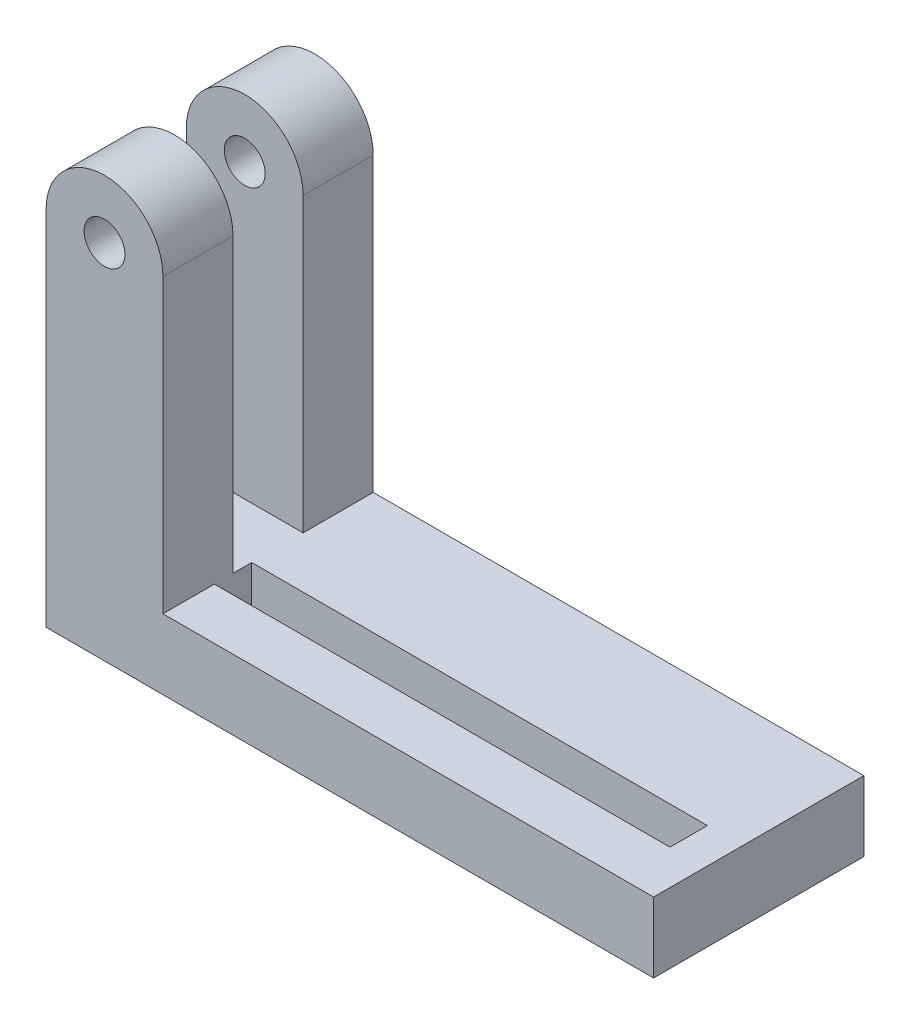
ISO-10303-21;
HEADER;
FILE_DESCRIPTION(('STEP AP214'),'2;1');
FILE_NAME('part.step','',(''),(''),'','','');
FILE_SCHEMA(('AUTOMOTIVE_DESIGN { 1 0 10303 214 1 1 1 1 }'));
ENDSEC;
DATA;
#1=APPLICATION_CONTEXT('core data for automotive mechanical design processes');
#2=APPLICATION_PROTOCOL_DEFINITION('international standard','automotive_design',2000,#1);
#3=PRODUCT_CONTEXT('',#1,'mechanical');
#4=PRODUCT('Part','Part','',(#3));
#5=PRODUCT_RELATED_PRODUCT_CATEGORY('part','',(#4));
#6=PRODUCT_DEFINITION_FORMATION('','',#4);
#7=PRODUCT_DEFINITION_CONTEXT('part definition',#1,'design');
#8=PRODUCT_DEFINITION('design','',#6,#7);
#9=PRODUCT_DEFINITION_SHAPE('','',#8);
#10=(LENGTH_UNIT() NAMED_UNIT(*) SI_UNIT(.MILLI.,.METRE.));
#11=(NAMED_UNIT(*) PLANE_ANGLE_UNIT() SI_UNIT($,.RADIAN.));
#12=(NAMED_UNIT(*) SI_UNIT($,.STERADIAN.) SOLID_ANGLE_UNIT());
#13=UNCERTAINTY_MEASURE_WITH_UNIT(LENGTH_MEASURE(1.E-05),#10,'distance_accuracy_value','');
#14=(GEOMETRIC_REPRESENTATION_CONTEXT(3) GLOBAL_UNCERTAINTY_ASSIGNED_CONTEXT((#13)) GLOBAL_UNIT_ASSIGNED_CONTEXT((#10,
#11,#12)) REPRESENTATION_CONTEXT('',''));
#15=CARTESIAN_POINT('',(0.,0.,0.));
#16=DIRECTION('',(0.,0.,1.));
#17=DIRECTION('',(1.,0.,0.));
#18=AXIS2_PLACEMENT_3D('',#15,#16,#17);
#19=CARTESIAN_POINT('',(-5.,7.611589663273,6.));
#20=DIRECTION('',(0.,0.,-1.));
#21=DIRECTION('',(-1.,0.,0.));
#22=AXIS2_PLACEMENT_3D('',#19,#20,#21);
#23=CYLINDRICAL_SURFACE('',#22,1.75);
#24=CARTESIAN_POINT('',(-5.,7.611589663273,6.));
#25=DIRECTION('',(0.,0.,-1.));
#26=DIRECTION('',(-1.,0.,0.));
#27=AXIS2_PLACEMENT_3D('',#24,#25,#26);
#28=CIRCLE('',#27,1.75);
#29=CARTESIAN_POINT('',(-6.75,7.611589663273,6.));
#30=VERTEX_POINT('',#29);
#31=EDGE_CURVE('E210',#30,#30,#28,.F.);
#32=ORIENTED_EDGE('',*,*,#31,.F.);
#33=EDGE_LOOP('',(#32));
#34=FACE_BOUND('',#33,.T.);
#35=CARTESIAN_POINT('',(-5.,7.611589663273,12.));
#36=DIRECTION('',(0.,0.,-1.));
#37=DIRECTION('',(-1.,0.,0.));
#38=AXIS2_PLACEMENT_3D('',#35,#36,#37);
#39=CIRCLE('',#38,1.75);
#40=CARTESIAN_POINT('',(-6.75,7.611589663273,12.));
#41=VERTEX_POINT('',#40);
#42=EDGE_CURVE('E164',#41,#41,#39,.T.);
#43=ORIENTED_EDGE('',*,*,#42,.F.);
#44=EDGE_LOOP('',(#43));
#45=FACE_BOUND('',#44,.T.);
#46=ADVANCED_FACE('F16',(#34,#45),#23,.F.);
#47=CARTESIAN_POINT('',(-5.,7.611589663273,0.));
#48=DIRECTION('',(0.,0.,1.));
#49=DIRECTION('',(1.,0.,0.));
#50=AXIS2_PLACEMENT_3D('',#47,#48,#49);
#51=PLANE('',#50);
#52=CARTESIAN_POINT('',(-5.,7.611589663273,0.));
#53=DIRECTION('',(0.,0.,-1.));
#54=DIRECTION('',(-1.,0.,0.));
#55=AXIS2_PLACEMENT_3D('',#52,#53,#54);
#56=CIRCLE('',#55,1.75);
#57=CARTESIAN_POINT('',(-6.75,7.611589663273,0.));
#58=VERTEX_POINT('',#57);
#59=EDGE_CURVE('E123',#58,#58,#56,.T.);
#60=ORIENTED_EDGE('',*,*,#59,.T.);
#61=EDGE_LOOP('',(#60));
#62=FACE_BOUND('',#61,.T.);
#63=DIRECTION('',(0.,1.,0.));
#64=VECTOR('',#63,1.);
#65=CARTESIAN_POINT('',(0.,7.611589663273,0.));
#66=LINE('',#65,#64);
#67=CARTESIAN_POINT('',(0.,7.611589663273,0.));
#68=VERTEX_POINT('',#67);
#69=CARTESIAN_POINT('',(0.,-17.38841033673,0.));
#70=VERTEX_POINT('',#69);
#71=EDGE_CURVE('E119',#68,#70,#66,.F.);
#72=ORIENTED_EDGE('',*,*,#71,.F.);
#73=CARTESIAN_POINT('',(-5.,7.611589663273,0.));
#74=DIRECTION('',(0.,0.,-1.));
#75=DIRECTION('',(-1.,0.,0.));
#76=AXIS2_PLACEMENT_3D('',#73,#74,#75);
#77=CIRCLE('',#76,5.);
#78=CARTESIAN_POINT('',(-10.,7.611589663273,0.));
#79=VERTEX_POINT('',#78);
#80=EDGE_CURVE('E19',#79,#68,#77,.T.);
#81=ORIENTED_EDGE('',*,*,#80,.F.);
#82=DIRECTION('',(0.,1.,0.));
#83=VECTOR('',#82,1.);
#84=CARTESIAN_POINT('',(-10.,7.611589663273,0.));
#85=LINE('',#84,#83);
#86=CARTESIAN_POINT('',(-10.,-17.38841033673,0.));
#87=VERTEX_POINT('',#86);
#88=EDGE_CURVE('E116',#87,#79,#85,.T.);
#89=ORIENTED_EDGE('',*,*,#88,.F.);
#90=DIRECTION('',(1.,0.,0.));
#91=VECTOR('',#90,1.);
#92=CARTESIAN_POINT('',(0.,-17.38841033673,0.));
#93=LINE('',#92,#91);
#94=EDGE_CURVE('E149',#87,#70,#93,.T.);
#95=ORIENTED_EDGE('',*,*,#94,.T.);
#96=EDGE_LOOP('',(#72,#81,#89,#95));
#97=FACE_BOUND('',#96,.T.);
#98=ADVANCED_FACE('F114',(#62,#97),#51,.T.);
#99=CARTESIAN_POINT('',(0.,7.611589663273,-6.));
#100=DIRECTION('',(1.,0.,0.));
#101=DIRECTION('',(0.,0.,-1.));
#102=AXIS2_PLACEMENT_3D('',#99,#100,#101);
#103=PLANE('',#102);
#104=DIRECTION('',(0.,0.,-1.));
#105=VECTOR('',#104,1.);
#106=CARTESIAN_POINT('',(0.,-17.38841033673,0.));
#107=LINE('',#106,#105);
#108=CARTESIAN_POINT('',(0.,-17.38841033673,-6.));
#109=VERTEX_POINT('',#108);
#110=EDGE_CURVE('E151',#70,#109,#107,.T.);
#111=ORIENTED_EDGE('',*,*,#110,.T.);
#112=DIRECTION('',(0.,1.,0.));
#113=VECTOR('',#112,1.);
#114=CARTESIAN_POINT('',(0.,7.611589663273,-6.));
#115=LINE('',#114,#113);
#116=CARTESIAN_POINT('',(0.,7.611589663273,-6.));
#117=VERTEX_POINT('',#116);
#118=EDGE_CURVE('E132',#109,#117,#115,.T.);
#119=ORIENTED_EDGE('',*,*,#118,.T.);
#120=DIRECTION('',(0.,0.,-1.));
#121=VECTOR('',#120,1.);
#122=CARTESIAN_POINT('',(0.,7.611589663273,-6.));
#123=LINE('',#122,#121);
#124=EDGE_CURVE('E124',#68,#117,#123,.T.);
#125=ORIENTED_EDGE('',*,*,#124,.F.);
#126=ORIENTED_EDGE('',*,*,#71,.T.);
#127=EDGE_LOOP('',(#111,#119,#125,#126));
#128=FACE_BOUND('',#127,.T.);
#129=ADVANCED_FACE('F229',(#128),#103,.T.);
#130=CARTESIAN_POINT('',(-5.,7.611589663273,-6.));
#131=DIRECTION('',(0.,0.,-1.));
#132=DIRECTION('',(-1.,0.,0.));
#133=AXIS2_PLACEMENT_3D('',#130,#131,#132);
#134=CYLINDRICAL_SURFACE('',#133,5.);
#135=DIRECTION('',(0.,0.,1.));
#136=VECTOR('',#135,1.);
#137=CARTESIAN_POINT('',(-10.,7.611589663273,-6.));
#138=LINE('',#137,#136);
#139=CARTESIAN_POINT('',(-10.,7.611589663273,-6.));
#140=VERTEX_POINT('',#139);
#141=EDGE_CURVE('E126',#79,#140,#138,.F.);
#142=ORIENTED_EDGE('',*,*,#141,.F.);
#143=ORIENTED_EDGE('',*,*,#80,.T.);
#144=ORIENTED_EDGE('',*,*,#124,.T.);
#145=CARTESIAN_POINT('',(-5.,7.611589663273,-6.));
#146=DIRECTION('',(0.,0.,-1.));
#147=DIRECTION('',(-1.,0.,0.));
#148=AXIS2_PLACEMENT_3D('',#145,#146,#147);
#149=CIRCLE('',#148,5.);
#150=EDGE_CURVE('E129',#117,#140,#149,.F.);
#151=ORIENTED_EDGE('',*,*,#150,.T.);
#152=EDGE_LOOP('',(#142,#143,#144,#151));
#153=FACE_BOUND('',#152,.T.);
#154=ADVANCED_FACE('F127',(#153),#134,.T.);
#155=CARTESIAN_POINT('',(-5.,7.611589663273,-6.));
#156=DIRECTION('',(0.,0.,-1.));
#157=DIRECTION('',(-1.,0.,0.));
#158=AXIS2_PLACEMENT_3D('',#155,#156,#157);
#159=CYLINDRICAL_SURFACE('',#158,1.75);
#160=CARTESIAN_POINT('',(-5.,7.611589663273,-6.));
#161=DIRECTION('',(0.,0.,-1.));
#162=DIRECTION('',(-1.,0.,0.));
#163=AXIS2_PLACEMENT_3D('',#160,#161,#162);
#164=CIRCLE('',#163,1.75);
#165=CARTESIAN_POINT('',(-6.75,7.611589663273,-6.));
#166=VERTEX_POINT('',#165);
#167=EDGE_CURVE('E199',#166,#166,#164,.T.);
#168=ORIENTED_EDGE('',*,*,#167,.T.);
#169=EDGE_LOOP('',(#168));
#170=FACE_BOUND('',#169,.T.);
#171=ORIENTED_EDGE('',*,*,#59,.F.);
#172=EDGE_LOOP('',(#171));
#173=FACE_BOUND('',#172,.T.);
#174=ADVANCED_FACE('F216',(#170,#173),#159,.F.);
#175=CARTESIAN_POINT('',(-10.,7.611589663273,6.));
#176=DIRECTION('',(0.,0.,-1.));
#177=DIRECTION('',(-1.,0.,0.));
#178=AXIS2_PLACEMENT_3D('',#175,#176,#177);
#179=PLANE('',#178);
#180=ORIENTED_EDGE('',*,*,#31,.T.);
#181=EDGE_LOOP('',(#180));
#182=FACE_BOUND('',#181,.T.);
#183=CARTESIAN_POINT('',(-5.,7.611589663273,6.));
#184=DIRECTION('',(0.,0.,-1.));
#185=DIRECTION('',(-1.,0.,0.));
#186=AXIS2_PLACEMENT_3D('',#183,#184,#185);
#187=CIRCLE('',#186,5.);
#188=CARTESIAN_POINT('',(0.,7.611589663273,6.));
#189=VERTEX_POINT('',#188);
#190=CARTESIAN_POINT('',(-10.,7.611589663273,6.));
#191=VERTEX_POINT('',#190);
#192=EDGE_CURVE('E208',#189,#191,#187,.F.);
#193=ORIENTED_EDGE('',*,*,#192,.F.);
#194=DIRECTION('',(0.,1.,0.));
#195=VECTOR('',#194,1.);
#196=CARTESIAN_POINT('',(0.,7.611589663273,6.));
#197=LINE('',#196,#195);
#198=CARTESIAN_POINT('',(0.,-17.38841033673,6.));
#199=VERTEX_POINT('',#198);
#200=EDGE_CURVE('E297',#199,#189,#197,.T.);
#201=ORIENTED_EDGE('',*,*,#200,.F.);
#202=DIRECTION('',(1.,0.,0.));
#203=VECTOR('',#202,1.);
#204=CARTESIAN_POINT('',(0.,-17.38841033673,6.));
#205=LINE('',#204,#203);
#206=CARTESIAN_POINT('',(-10.,-17.38841033673,6.));
#207=VERTEX_POINT('',#206);
#208=EDGE_CURVE('E152',#199,#207,#205,.F.);
#209=ORIENTED_EDGE('',*,*,#208,.T.);
#210=DIRECTION('',(0.,1.,0.));
#211=VECTOR('',#210,1.);
#212=CARTESIAN_POINT('',(-10.,7.611589663273,6.));
#213=LINE('',#212,#211);
#214=EDGE_CURVE('E139',#191,#207,#213,.F.);
#215=ORIENTED_EDGE('',*,*,#214,.F.);
#216=EDGE_LOOP('',(#193,#201,#209,#215));
#217=FACE_BOUND('',#216,.T.);
#218=ADVANCED_FACE('F218',(#182,#217),#179,.T.);
#219=CARTESIAN_POINT('',(-5.,7.611589663273,6.));
#220=DIRECTION('',(0.,0.,-1.));
#221=DIRECTION('',(-1.,0.,0.));
#222=AXIS2_PLACEMENT_3D('',#219,#220,#221);
#223=CYLINDRICAL_SURFACE('',#222,5.);
#224=ORIENTED_EDGE('',*,*,#192,.T.);
#225=DIRECTION('',(0.,0.,1.));
#226=VECTOR('',#225,1.);
#227=CARTESIAN_POINT('',(-10.,7.611589663273,-6.));
#228=LINE('',#227,#226);
#229=CARTESIAN_POINT('',(-10.,7.611589663273,12.));
#230=VERTEX_POINT('',#229);
#231=EDGE_CURVE('E156',#230,#191,#228,.F.);
#232=ORIENTED_EDGE('',*,*,#231,.F.);
#233=CARTESIAN_POINT('',(-5.,7.611589663273,12.));
#234=DIRECTION('',(0.,0.,-1.));
#235=DIRECTION('',(-1.,0.,0.));
#236=AXIS2_PLACEMENT_3D('',#233,#234,#235);
#237=CIRCLE('',#236,5.);
#238=CARTESIAN_POINT('',(0.,7.611589663273,12.));
#239=VERTEX_POINT('',#238);
#240=EDGE_CURVE('E206',#239,#230,#237,.F.);
#241=ORIENTED_EDGE('',*,*,#240,.F.);
#242=DIRECTION('',(0.,0.,-1.));
#243=VECTOR('',#242,1.);
#244=CARTESIAN_POINT('',(0.,7.611589663273,6.));
#245=LINE('',#244,#243);
#246=EDGE_CURVE('E281',#189,#239,#245,.F.);
#247=ORIENTED_EDGE('',*,*,#246,.F.);
#248=EDGE_LOOP('',(#224,#232,#241,#247));
#249=FACE_BOUND('',#248,.T.);
#250=ADVANCED_FACE('F226',(#249),#223,.T.);
#251=CARTESIAN_POINT('',(0.,-17.38841033673,0.));
#252=DIRECTION('',(0.,-1.,0.));
#253=DIRECTION('',(0.,0.,-1.));
#254=AXIS2_PLACEMENT_3D('',#251,#252,#253);
#255=PLANE('',#254);
#256=ORIENTED_EDGE('',*,*,#94,.F.);
#257=DIRECTION('',(0.,0.,1.));
#258=VECTOR('',#257,1.);
#259=CARTESIAN_POINT('',(-10.,-17.38841033673,-6.));
#260=LINE('',#259,#258);
#261=EDGE_CURVE('E137',#207,#87,#260,.F.);
#262=ORIENTED_EDGE('',*,*,#261,.F.);
#263=ORIENTED_EDGE('',*,*,#208,.F.);
#264=DIRECTION('',(0.,0.,-1.));
#265=VECTOR('',#264,1.);
#266=CARTESIAN_POINT('',(0.,-17.38841033673,6.));
#267=LINE('',#266,#265);
#268=CARTESIAN_POINT('',(0.,-17.38841033673,4.4));
#269=VERTEX_POINT('',#268);
#270=EDGE_CURVE('E299',#269,#199,#267,.F.);
#271=ORIENTED_EDGE('',*,*,#270,.F.);
#272=DIRECTION('',(1.,0.,0.));
#273=VECTOR('',#272,1.);
#274=CARTESIAN_POINT('',(39.,-17.38841033673,4.4));
#275=LINE('',#274,#273);
#276=CARTESIAN_POINT('',(39.,-17.38841033673,4.4));
#277=VERTEX_POINT('',#276);
#278=EDGE_CURVE('E325',#277,#269,#275,.F.);
#279=ORIENTED_EDGE('',*,*,#278,.F.);
#280=DIRECTION('',(0.,0.,1.));
#281=VECTOR('',#280,1.);
#282=CARTESIAN_POINT('',(39.,-17.38841033673,7.6));
#283=LINE('',#282,#281);
#284=CARTESIAN_POINT('',(39.,-17.38841033673,7.6));
#285=VERTEX_POINT('',#284);
#286=EDGE_CURVE('E338',#285,#277,#283,.F.);
#287=ORIENTED_EDGE('',*,*,#286,.F.);
#288=DIRECTION('',(-1.,0.,0.));
#289=VECTOR('',#288,1.);
#290=CARTESIAN_POINT('',(0.,-17.38841033673,7.6));
#291=LINE('',#290,#289);
#292=CARTESIAN_POINT('',(0.,-17.38841033673,7.6));
#293=VERTEX_POINT('',#292);
#294=EDGE_CURVE('E202',#293,#285,#291,.F.);
#295=ORIENTED_EDGE('',*,*,#294,.F.);
#296=DIRECTION('',(0.,0.,-1.));
#297=VECTOR('',#296,1.);
#298=CARTESIAN_POINT('',(0.,-17.38841033673,6.));
#299=LINE('',#298,#297);
#300=CARTESIAN_POINT('',(0.,-17.38841033673,12.));
#301=VERTEX_POINT('',#300);
#302=EDGE_CURVE('E186',#301,#293,#299,.T.);
#303=ORIENTED_EDGE('',*,*,#302,.F.);
#304=DIRECTION('',(1.,0.,0.));
#305=VECTOR('',#304,1.);
#306=CARTESIAN_POINT('',(-10.,-17.38841033673,12.));
#307=LINE('',#306,#305);
#308=CARTESIAN_POINT('',(42.,-17.38841033673,12.));
#309=VERTEX_POINT('',#308);
#310=EDGE_CURVE('E177',#309,#301,#307,.F.);
#311=ORIENTED_EDGE('',*,*,#310,.F.);
#312=DIRECTION('',(0.,0.,1.));
#313=VECTOR('',#312,1.);
#314=CARTESIAN_POINT('',(42.,-17.38841033673,0.));
#315=LINE('',#314,#313);
#316=CARTESIAN_POINT('',(42.,-17.38841033673,-6.));
#317=VERTEX_POINT('',#316);
#318=EDGE_CURVE('E178',#309,#317,#315,.F.);
#319=ORIENTED_EDGE('',*,*,#318,.T.);
#320=DIRECTION('',(1.,0.,0.));
#321=VECTOR('',#320,1.);
#322=CARTESIAN_POINT('',(-5.,-17.38841033673,-6.));
#323=LINE('',#322,#321);
#324=EDGE_CURVE('E192',#317,#109,#323,.F.);
#325=ORIENTED_EDGE('',*,*,#324,.T.);
#326=ORIENTED_EDGE('',*,*,#110,.F.);
#327=EDGE_LOOP('',(#256,#262,#263,#271,#279,#287,#295,#303,#311,#319,#325,#326));
#328=FACE_BOUND('',#327,.T.);
#329=ADVANCED_FACE('F268',(#328),#255,.F.);
#330=CARTESIAN_POINT('',(42.,0.,0.));
#331=DIRECTION('',(-1.,0.,0.));
#332=DIRECTION('',(0.,0.,1.));
#333=AXIS2_PLACEMENT_3D('',#330,#331,#332);
#334=PLANE('',#333);
#335=DIRECTION('',(0.,1.,0.));
#336=VECTOR('',#335,1.);
#337=CARTESIAN_POINT('',(42.,7.611589663273,12.));
#338=LINE('',#337,#336);
#339=CARTESIAN_POINT('',(42.,-23.38841033673,12.));
#340=VERTEX_POINT('',#339);
#341=EDGE_CURVE('E174',#340,#309,#338,.T.);
#342=ORIENTED_EDGE('',*,*,#341,.F.);
#343=DIRECTION('',(0.,0.,-1.));
#344=VECTOR('',#343,1.);
#345=CARTESIAN_POINT('',(42.,-23.38841033673,0.));
#346=LINE('',#345,#344);
#347=CARTESIAN_POINT('',(42.,-23.38841033673,-6.));
#348=VERTEX_POINT('',#347);
#349=EDGE_CURVE('E171',#348,#340,#346,.F.);
#350=ORIENTED_EDGE('',*,*,#349,.F.);
#351=DIRECTION('',(0.,1.,0.));
#352=VECTOR('',#351,1.);
#353=CARTESIAN_POINT('',(42.,7.611589663273,-6.));
#354=LINE('',#353,#352);
#355=EDGE_CURVE('E189',#348,#317,#354,.T.);
#356=ORIENTED_EDGE('',*,*,#355,.T.);
#357=ORIENTED_EDGE('',*,*,#318,.F.);
#358=EDGE_LOOP('',(#342,#350,#356,#357));
#359=FACE_BOUND('',#358,.T.);
#360=ADVANCED_FACE('F264',(#359),#334,.F.);
#361=CARTESIAN_POINT('',(-10.,7.611589663273,12.));
#362=DIRECTION('',(0.,0.,1.));
#363=DIRECTION('',(1.,0.,0.));
#364=AXIS2_PLACEMENT_3D('',#361,#362,#363);
#365=PLANE('',#364);
#366=ORIENTED_EDGE('',*,*,#42,.T.);
#367=EDGE_LOOP('',(#366));
#368=FACE_BOUND('',#367,.T.);
#369=DIRECTION('',(0.,1.,0.));
#370=VECTOR('',#369,1.);
#371=CARTESIAN_POINT('',(-10.,7.611589663273,12.));
#372=LINE('',#371,#370);
#373=CARTESIAN_POINT('',(-10.,-23.38841033673,12.));
#374=VERTEX_POINT('',#373);
#375=EDGE_CURVE('E161',#374,#230,#372,.T.);
#376=ORIENTED_EDGE('',*,*,#375,.F.);
#377=DIRECTION('',(1.,0.,0.));
#378=VECTOR('',#377,1.);
#379=CARTESIAN_POINT('',(0.,-23.38841033673,12.));
#380=LINE('',#379,#378);
#381=EDGE_CURVE('E167',#340,#374,#380,.F.);
#382=ORIENTED_EDGE('',*,*,#381,.F.);
#383=ORIENTED_EDGE('',*,*,#341,.T.);
#384=ORIENTED_EDGE('',*,*,#310,.T.);
#385=DIRECTION('',(0.,1.,0.));
#386=VECTOR('',#385,1.);
#387=CARTESIAN_POINT('',(0.,7.611589663273,12.));
#388=LINE('',#387,#386);
#389=EDGE_CURVE('E291',#239,#301,#388,.F.);
#390=ORIENTED_EDGE('',*,*,#389,.F.);
#391=ORIENTED_EDGE('',*,*,#240,.T.);
#392=EDGE_LOOP('',(#376,#382,#383,#384,#390,#391));
#393=FACE_BOUND('',#392,.T.);
#394=ADVANCED_FACE('F261',(#368,#393),#365,.T.);
#395=CARTESIAN_POINT('',(-10.,7.611589663273,-6.));
#396=DIRECTION('',(-1.,0.,0.));
#397=DIRECTION('',(0.,0.,1.));
#398=AXIS2_PLACEMENT_3D('',#395,#396,#397);
#399=PLANE('',#398);
#400=ORIENTED_EDGE('',*,*,#141,.T.);
#401=DIRECTION('',(0.,1.,0.));
#402=VECTOR('',#401,1.);
#403=CARTESIAN_POINT('',(-10.,7.611589663273,-6.));
#404=LINE('',#403,#402);
#405=CARTESIAN_POINT('',(-10.,-23.38841033673,-6.));
#406=VERTEX_POINT('',#405);
#407=EDGE_CURVE('E193',#140,#406,#404,.F.);
#408=ORIENTED_EDGE('',*,*,#407,.T.);
#409=DIRECTION('',(0.,0.,-1.));
#410=VECTOR('',#409,1.);
#411=CARTESIAN_POINT('',(-10.,-23.38841033673,0.));
#412=LINE('',#411,#410);
#413=EDGE_CURVE('E170',#374,#406,#412,.T.);
#414=ORIENTED_EDGE('',*,*,#413,.F.);
#415=ORIENTED_EDGE('',*,*,#375,.T.);
#416=ORIENTED_EDGE('',*,*,#231,.T.);
#417=ORIENTED_EDGE('',*,*,#214,.T.);
#418=ORIENTED_EDGE('',*,*,#261,.T.);
#419=ORIENTED_EDGE('',*,*,#88,.T.);
#420=EDGE_LOOP('',(#400,#408,#414,#415,#416,#417,#418,#419));
#421=FACE_BOUND('',#420,.T.);
#422=ADVANCED_FACE('F134',(#421),#399,.T.);
#423=CARTESIAN_POINT('',(-5.,7.611589663273,-6.));
#424=DIRECTION('',(0.,0.,1.));
#425=DIRECTION('',(1.,0.,0.));
#426=AXIS2_PLACEMENT_3D('',#423,#424,#425);
#427=PLANE('',#426);
#428=ORIENTED_EDGE('',*,*,#167,.F.);
#429=EDGE_LOOP('',(#428));
#430=FACE_BOUND('',#429,.T.);
#431=ORIENTED_EDGE('',*,*,#355,.F.);
#432=DIRECTION('',(1.,0.,0.));
#433=VECTOR('',#432,1.);
#434=CARTESIAN_POINT('',(0.,-23.38841033673,-6.));
#435=LINE('',#434,#433);
#436=EDGE_CURVE('E359',#406,#348,#435,.T.);
#437=ORIENTED_EDGE('',*,*,#436,.F.);
#438=ORIENTED_EDGE('',*,*,#407,.F.);
#439=ORIENTED_EDGE('',*,*,#150,.F.);
#440=ORIENTED_EDGE('',*,*,#118,.F.);
#441=ORIENTED_EDGE('',*,*,#324,.F.);
#442=EDGE_LOOP('',(#431,#437,#438,#439,#440,#441));
#443=FACE_BOUND('',#442,.T.);
#444=ADVANCED_FACE('F254',(#430,#443),#427,.F.);
#445=CARTESIAN_POINT('',(0.,-23.38841033673,7.6));
#446=DIRECTION('',(0.,0.,-1.));
#447=DIRECTION('',(-1.,0.,0.));
#448=AXIS2_PLACEMENT_3D('',#445,#446,#447);
#449=PLANE('',#448);
#450=DIRECTION('',(0.,1.,0.));
#451=VECTOR('',#450,1.);
#452=CARTESIAN_POINT('',(0.,7.611589663273,7.6));
#453=LINE('',#452,#451);
#454=CARTESIAN_POINT('',(0.,-23.38841033673,7.6));
#455=VERTEX_POINT('',#454);
#456=EDGE_CURVE('E322',#293,#455,#453,.F.);
#457=ORIENTED_EDGE('',*,*,#456,.F.);
#458=ORIENTED_EDGE('',*,*,#294,.T.);
#459=DIRECTION('',(0.,1.,0.));
#460=VECTOR('',#459,1.);
#461=CARTESIAN_POINT('',(39.,-23.38841033673,7.6));
#462=LINE('',#461,#460);
#463=CARTESIAN_POINT('',(39.,-23.38841033673,7.6));
#464=VERTEX_POINT('',#463);
#465=EDGE_CURVE('E342',#464,#285,#462,.T.);
#466=ORIENTED_EDGE('',*,*,#465,.F.);
#467=DIRECTION('',(1.,0.,0.));
#468=VECTOR('',#467,1.);
#469=CARTESIAN_POINT('',(0.,-23.38841033673,7.6));
#470=LINE('',#469,#468);
#471=EDGE_CURVE('E347',#455,#464,#470,.T.);
#472=ORIENTED_EDGE('',*,*,#471,.F.);
#473=EDGE_LOOP('',(#457,#458,#466,#472));
#474=FACE_BOUND('',#473,.T.);
#475=ADVANCED_FACE('F250',(#474),#449,.T.);
#476=CARTESIAN_POINT('',(39.,-23.38841033673,7.6));
#477=DIRECTION('',(-1.,0.,0.));
#478=DIRECTION('',(0.,0.,1.));
#479=AXIS2_PLACEMENT_3D('',#476,#477,#478);
#480=PLANE('',#479);
#481=ORIENTED_EDGE('',*,*,#465,.T.);
#482=ORIENTED_EDGE('',*,*,#286,.T.);
#483=DIRECTION('',(0.,1.,0.));
#484=VECTOR('',#483,1.);
#485=CARTESIAN_POINT('',(39.,-23.38841033673,4.4));
#486=LINE('',#485,#484);
#487=CARTESIAN_POINT('',(39.,-23.38841033673,4.4));
#488=VERTEX_POINT('',#487);
#489=EDGE_CURVE('E327',#488,#277,#486,.T.);
#490=ORIENTED_EDGE('',*,*,#489,.F.);
#491=DIRECTION('',(0.,0.,-1.));
#492=VECTOR('',#491,1.);
#493=CARTESIAN_POINT('',(39.,-23.38841033673,0.));
#494=LINE('',#493,#492);
#495=EDGE_CURVE('E333',#464,#488,#494,.T.);
#496=ORIENTED_EDGE('',*,*,#495,.F.);
#497=EDGE_LOOP('',(#481,#482,#490,#496));
#498=FACE_BOUND('',#497,.T.);
#499=ADVANCED_FACE('F247',(#498),#480,.T.);
#500=CARTESIAN_POINT('',(39.,-23.38841033673,4.4));
#501=DIRECTION('',(0.,0.,1.));
#502=DIRECTION('',(1.,0.,0.));
#503=AXIS2_PLACEMENT_3D('',#500,#501,#502);
#504=PLANE('',#503);
#505=ORIENTED_EDGE('',*,*,#489,.T.);
#506=ORIENTED_EDGE('',*,*,#278,.T.);
#507=DIRECTION('',(0.,1.,0.));
#508=VECTOR('',#507,1.);
#509=CARTESIAN_POINT('',(0.,7.611589663273,4.4));
#510=LINE('',#509,#508);
#511=CARTESIAN_POINT('',(0.,-23.38841033673,4.4));
#512=VERTEX_POINT('',#511);
#513=EDGE_CURVE('E34',#512,#269,#510,.T.);
#514=ORIENTED_EDGE('',*,*,#513,.F.);
#515=DIRECTION('',(1.,0.,0.));
#516=VECTOR('',#515,1.);
#517=CARTESIAN_POINT('',(0.,-23.38841033673,4.4));
#518=LINE('',#517,#516);
#519=EDGE_CURVE('E25',#488,#512,#518,.F.);
#520=ORIENTED_EDGE('',*,*,#519,.F.);
#521=EDGE_LOOP('',(#505,#506,#514,#520));
#522=FACE_BOUND('',#521,.T.);
#523=ADVANCED_FACE('F239',(#522),#504,.T.);
#524=CARTESIAN_POINT('',(0.,7.611589663273,6.));
#525=DIRECTION('',(1.,0.,0.));
#526=DIRECTION('',(0.,0.,-1.));
#527=AXIS2_PLACEMENT_3D('',#524,#525,#526);
#528=PLANE('',#527);
#529=ORIENTED_EDGE('',*,*,#389,.T.);
#530=ORIENTED_EDGE('',*,*,#302,.T.);
#531=ORIENTED_EDGE('',*,*,#456,.T.);
#532=DIRECTION('',(0.,0.,-1.));
#533=VECTOR('',#532,1.);
#534=CARTESIAN_POINT('',(0.,-23.38841033673,0.));
#535=LINE('',#534,#533);
#536=EDGE_CURVE('E10',#512,#455,#535,.F.);
#537=ORIENTED_EDGE('',*,*,#536,.F.);
#538=ORIENTED_EDGE('',*,*,#513,.T.);
#539=ORIENTED_EDGE('',*,*,#270,.T.);
#540=ORIENTED_EDGE('',*,*,#200,.T.);
#541=ORIENTED_EDGE('',*,*,#246,.T.);
#542=EDGE_LOOP('',(#529,#530,#531,#537,#538,#539,#540,#541));
#543=FACE_BOUND('',#542,.T.);
#544=ADVANCED_FACE('F233',(#543),#528,.T.);
#545=CARTESIAN_POINT('',(0.,-23.38841033673,0.));
#546=DIRECTION('',(0.,-1.,0.));
#547=DIRECTION('',(0.,0.,-1.));
#548=AXIS2_PLACEMENT_3D('',#545,#546,#547);
#549=PLANE('',#548);
#550=ORIENTED_EDGE('',*,*,#519,.T.);
#551=ORIENTED_EDGE('',*,*,#536,.T.);
#552=ORIENTED_EDGE('',*,*,#471,.T.);
#553=ORIENTED_EDGE('',*,*,#495,.T.);
#554=EDGE_LOOP('',(#550,#551,#552,#553));
#555=FACE_BOUND('',#554,.T.);
#556=ORIENTED_EDGE('',*,*,#413,.T.);
#557=ORIENTED_EDGE('',*,*,#436,.T.);
#558=ORIENTED_EDGE('',*,*,#349,.T.);
#559=ORIENTED_EDGE('',*,*,#381,.T.);
#560=EDGE_LOOP('',(#556,#557,#558,#559));
#561=FACE_BOUND('',#560,.T.);
#562=ADVANCED_FACE('F231',(#555,#561),#549,.T.);
#563=CLOSED_SHELL('',(#46,#98,#129,#154,#174,#218,#250,#329,#360,#394,#422,#444,#475,#499,#523,
#544,#562));
#564=MANIFOLD_SOLID_BREP('B1',#563);
#565=ADVANCED_BREP_SHAPE_REPRESENTATION('',(#18,#564),#14);
#566=SHAPE_DEFINITION_REPRESENTATION(#9,#565);
ENDSEC;
END-ISO-10303-21;
